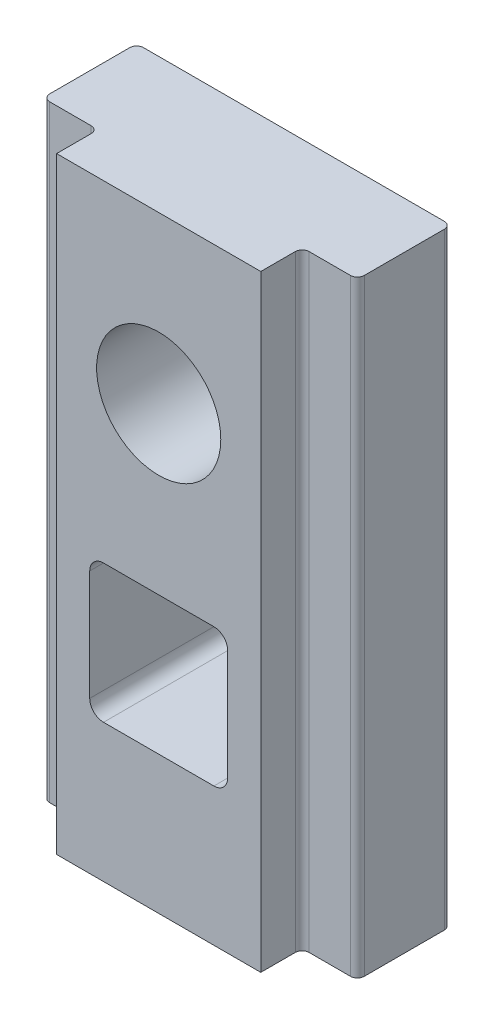
ISO-10303-21;
HEADER;
FILE_DESCRIPTION(('STEP AP214'),'2;1');
FILE_NAME('part.step','',(''),(''),'','','');
FILE_SCHEMA(('AUTOMOTIVE_DESIGN { 1 0 10303 214 1 1 1 1 }'));
ENDSEC;
DATA;
#1=APPLICATION_CONTEXT('core data for automotive mechanical design processes');
#2=APPLICATION_PROTOCOL_DEFINITION('international standard','automotive_design',2000,#1);
#3=PRODUCT_CONTEXT('',#1,'mechanical');
#4=PRODUCT('Part','Part','',(#3));
#5=PRODUCT_RELATED_PRODUCT_CATEGORY('part','',(#4));
#6=PRODUCT_DEFINITION_FORMATION('','',#4);
#7=PRODUCT_DEFINITION_CONTEXT('part definition',#1,'design');
#8=PRODUCT_DEFINITION('design','',#6,#7);
#9=PRODUCT_DEFINITION_SHAPE('','',#8);
#10=(LENGTH_UNIT() NAMED_UNIT(*) SI_UNIT(.MILLI.,.METRE.));
#11=(NAMED_UNIT(*) PLANE_ANGLE_UNIT() SI_UNIT($,.RADIAN.));
#12=(NAMED_UNIT(*) SI_UNIT($,.STERADIAN.) SOLID_ANGLE_UNIT());
#13=UNCERTAINTY_MEASURE_WITH_UNIT(LENGTH_MEASURE(1.E-05),#10,'distance_accuracy_value','');
#14=(GEOMETRIC_REPRESENTATION_CONTEXT(3) GLOBAL_UNCERTAINTY_ASSIGNED_CONTEXT((#13)) GLOBAL_UNIT_ASSIGNED_CONTEXT((#10,
#11,#12)) REPRESENTATION_CONTEXT('',''));
#15=CARTESIAN_POINT('',(0.,0.,0.));
#16=DIRECTION('',(0.,0.,1.));
#17=DIRECTION('',(1.,0.,0.));
#18=AXIS2_PLACEMENT_3D('',#15,#16,#17);
#19=CARTESIAN_POINT('',(5.7,-22.,-0.3));
#20=DIRECTION('',(0.,0.,1.));
#21=DIRECTION('',(1.,0.,0.));
#22=AXIS2_PLACEMENT_3D('',#19,#20,#21);
#23=PLANE('',#22);
#24=DIRECTION('',(1.,0.,0.));
#25=VECTOR('',#24,1.);
#26=CARTESIAN_POINT('',(5.7,-22.,-0.3));
#27=LINE('',#26,#25);
#28=CARTESIAN_POINT('',(3.95,-22.,-0.3));
#29=VERTEX_POINT('',#28);
#30=CARTESIAN_POINT('',(5.45,-22.,-0.3));
#31=VERTEX_POINT('',#30);
#32=EDGE_CURVE('E233',#29,#31,#27,.T.);
#33=ORIENTED_EDGE('',*,*,#32,.T.);
#34=DIRECTION('',(0.,1.,0.));
#35=VECTOR('',#34,1.);
#36=CARTESIAN_POINT('',(5.45,-22.,-0.3));
#37=LINE('',#36,#35);
#38=CARTESIAN_POINT('',(5.45,0.,-0.3));
#39=VERTEX_POINT('',#38);
#40=EDGE_CURVE('E263',#31,#39,#37,.T.);
#41=ORIENTED_EDGE('',*,*,#40,.T.);
#42=DIRECTION('',(1.,0.,0.));
#43=VECTOR('',#42,1.);
#44=CARTESIAN_POINT('',(5.7,0.,-0.3));
#45=LINE('',#44,#43);
#46=CARTESIAN_POINT('',(3.95,0.,-0.3));
#47=VERTEX_POINT('',#46);
#48=EDGE_CURVE('E211',#47,#39,#45,.T.);
#49=ORIENTED_EDGE('',*,*,#48,.F.);
#50=DIRECTION('',(0.,1.,0.));
#51=VECTOR('',#50,1.);
#52=CARTESIAN_POINT('',(3.95,-22.,-0.3));
#53=LINE('',#52,#51);
#54=EDGE_CURVE('E261',#47,#29,#53,.F.);
#55=ORIENTED_EDGE('',*,*,#54,.T.);
#56=EDGE_LOOP('',(#33,#41,#49,#55));
#57=FACE_BOUND('',#56,.T.);
#58=ADVANCED_FACE('F32',(#57),#23,.T.);
#59=CARTESIAN_POINT('',(3.7,-22.,-0.3));
#60=DIRECTION('',(1.,0.,0.));
#61=DIRECTION('',(0.,0.,-1.));
#62=AXIS2_PLACEMENT_3D('',#59,#60,#61);
#63=PLANE('',#62);
#64=DIRECTION('',(0.,0.,-1.));
#65=VECTOR('',#64,1.);
#66=CARTESIAN_POINT('',(3.7,-22.,-0.3));
#67=LINE('',#66,#65);
#68=CARTESIAN_POINT('',(3.7,-22.,1.2));
#69=VERTEX_POINT('',#68);
#70=CARTESIAN_POINT('',(3.7,-22.,-0.0499999999999998));
#71=VERTEX_POINT('',#70);
#72=EDGE_CURVE('E202',#69,#71,#67,.T.);
#73=ORIENTED_EDGE('',*,*,#72,.T.);
#74=DIRECTION('',(0.,1.,0.));
#75=VECTOR('',#74,1.);
#76=CARTESIAN_POINT('',(3.7,0.,-0.0499999999999998));
#77=LINE('',#76,#75);
#78=CARTESIAN_POINT('',(3.7,0.,-0.0499999999999998));
#79=VERTEX_POINT('',#78);
#80=EDGE_CURVE('E266',#71,#79,#77,.T.);
#81=ORIENTED_EDGE('',*,*,#80,.T.);
#82=DIRECTION('',(0.,0.,-1.));
#83=VECTOR('',#82,1.);
#84=CARTESIAN_POINT('',(3.7,0.,-0.3));
#85=LINE('',#84,#83);
#86=CARTESIAN_POINT('',(3.7,0.,1.2));
#87=VERTEX_POINT('',#86);
#88=EDGE_CURVE('E230',#87,#79,#85,.T.);
#89=ORIENTED_EDGE('',*,*,#88,.F.);
#90=DIRECTION('',(0.,1.,0.));
#91=VECTOR('',#90,1.);
#92=CARTESIAN_POINT('',(3.7,-22.,1.2));
#93=LINE('',#92,#91);
#94=EDGE_CURVE('E201',#69,#87,#93,.T.);
#95=ORIENTED_EDGE('',*,*,#94,.F.);
#96=EDGE_LOOP('',(#73,#81,#89,#95));
#97=FACE_BOUND('',#96,.T.);
#98=ADVANCED_FACE('F414',(#97),#63,.T.);
#99=CARTESIAN_POINT('',(-3.7,-22.,1.2));
#100=DIRECTION('',(0.,0.,1.));
#101=DIRECTION('',(1.,0.,0.));
#102=AXIS2_PLACEMENT_3D('',#99,#100,#101);
#103=PLANE('',#102);
#104=CARTESIAN_POINT('',(0.,-6.,1.2));
#105=DIRECTION('',(0.,0.,1.));
#106=DIRECTION('',(1.,0.,0.));
#107=AXIS2_PLACEMENT_3D('',#104,#105,#106);
#108=CIRCLE('',#107,2.25);
#109=CARTESIAN_POINT('',(2.25,-6.,1.2));
#110=VERTEX_POINT('',#109);
#111=EDGE_CURVE('E346',#110,#110,#108,.T.);
#112=ORIENTED_EDGE('',*,*,#111,.F.);
#113=EDGE_LOOP('',(#112));
#114=FACE_BOUND('',#113,.T.);
#115=DIRECTION('',(0.,1.,0.));
#116=VECTOR('',#115,1.);
#117=CARTESIAN_POINT('',(2.5,-12.,1.2));
#118=LINE('',#117,#116);
#119=CARTESIAN_POINT('',(2.5,-16.5,1.2));
#120=VERTEX_POINT('',#119);
#121=CARTESIAN_POINT('',(2.5,-12.5,1.2));
#122=VERTEX_POINT('',#121);
#123=EDGE_CURVE('E322',#120,#122,#118,.T.);
#124=ORIENTED_EDGE('',*,*,#123,.F.);
#125=CARTESIAN_POINT('',(2.,-16.5,1.2));
#126=DIRECTION('',(0.,0.,1.));
#127=DIRECTION('',(1.,0.,0.));
#128=AXIS2_PLACEMENT_3D('',#125,#126,#127);
#129=CIRCLE('',#128,0.5);
#130=CARTESIAN_POINT('',(2.,-17.,1.2));
#131=VERTEX_POINT('',#130);
#132=EDGE_CURVE('E307',#120,#131,#129,.F.);
#133=ORIENTED_EDGE('',*,*,#132,.T.);
#134=DIRECTION('',(1.,0.,0.));
#135=VECTOR('',#134,1.);
#136=CARTESIAN_POINT('',(-2.5,-17.,1.2));
#137=LINE('',#136,#135);
#138=CARTESIAN_POINT('',(-2.,-17.,1.2));
#139=VERTEX_POINT('',#138);
#140=EDGE_CURVE('E341',#139,#131,#137,.T.);
#141=ORIENTED_EDGE('',*,*,#140,.F.);
#142=CARTESIAN_POINT('',(-2.,-16.5,1.2));
#143=DIRECTION('',(0.,0.,1.));
#144=DIRECTION('',(1.,0.,0.));
#145=AXIS2_PLACEMENT_3D('',#142,#143,#144);
#146=CIRCLE('',#145,0.5);
#147=CARTESIAN_POINT('',(-2.5,-16.5,1.2));
#148=VERTEX_POINT('',#147);
#149=EDGE_CURVE('E311',#139,#148,#146,.F.);
#150=ORIENTED_EDGE('',*,*,#149,.T.);
#151=DIRECTION('',(0.,-1.,0.));
#152=VECTOR('',#151,1.);
#153=CARTESIAN_POINT('',(-2.5,-12.,1.2));
#154=LINE('',#153,#152);
#155=CARTESIAN_POINT('',(-2.5,-12.5,1.2));
#156=VERTEX_POINT('',#155);
#157=EDGE_CURVE('E349',#156,#148,#154,.T.);
#158=ORIENTED_EDGE('',*,*,#157,.F.);
#159=CARTESIAN_POINT('',(-2.,-12.5,1.2));
#160=DIRECTION('',(0.,0.,1.));
#161=DIRECTION('',(1.,0.,0.));
#162=AXIS2_PLACEMENT_3D('',#159,#160,#161);
#163=CIRCLE('',#162,0.5);
#164=CARTESIAN_POINT('',(-2.,-12.,1.2));
#165=VERTEX_POINT('',#164);
#166=EDGE_CURVE('E315',#156,#165,#163,.F.);
#167=ORIENTED_EDGE('',*,*,#166,.T.);
#168=DIRECTION('',(-1.,0.,0.));
#169=VECTOR('',#168,1.);
#170=CARTESIAN_POINT('',(-2.5,-12.,1.2));
#171=LINE('',#170,#169);
#172=CARTESIAN_POINT('',(2.,-12.,1.2));
#173=VERTEX_POINT('',#172);
#174=EDGE_CURVE('E323',#173,#165,#171,.T.);
#175=ORIENTED_EDGE('',*,*,#174,.F.);
#176=CARTESIAN_POINT('',(2.,-12.5,1.2));
#177=DIRECTION('',(0.,0.,1.));
#178=DIRECTION('',(1.,0.,0.));
#179=AXIS2_PLACEMENT_3D('',#176,#177,#178);
#180=CIRCLE('',#179,0.5);
#181=EDGE_CURVE('E40',#173,#122,#180,.F.);
#182=ORIENTED_EDGE('',*,*,#181,.T.);
#183=EDGE_LOOP('',(#124,#133,#141,#150,#158,#167,#175,#182));
#184=FACE_BOUND('',#183,.T.);
#185=DIRECTION('',(1.,0.,0.));
#186=VECTOR('',#185,1.);
#187=CARTESIAN_POINT('',(-3.7,0.,1.2));
#188=LINE('',#187,#186);
#189=CARTESIAN_POINT('',(-3.7,0.,1.2));
#190=VERTEX_POINT('',#189);
#191=EDGE_CURVE('E200',#190,#87,#188,.T.);
#192=ORIENTED_EDGE('',*,*,#191,.F.);
#193=DIRECTION('',(0.,1.,0.));
#194=VECTOR('',#193,1.);
#195=CARTESIAN_POINT('',(-3.7,-22.,1.2));
#196=LINE('',#195,#194);
#197=CARTESIAN_POINT('',(-3.7,-22.,1.2));
#198=VERTEX_POINT('',#197);
#199=EDGE_CURVE('E185',#198,#190,#196,.T.);
#200=ORIENTED_EDGE('',*,*,#199,.F.);
#201=DIRECTION('',(1.,0.,0.));
#202=VECTOR('',#201,1.);
#203=CARTESIAN_POINT('',(-3.7,-22.,1.2));
#204=LINE('',#203,#202);
#205=EDGE_CURVE('E192',#198,#69,#204,.T.);
#206=ORIENTED_EDGE('',*,*,#205,.T.);
#207=ORIENTED_EDGE('',*,*,#94,.T.);
#208=EDGE_LOOP('',(#192,#200,#206,#207));
#209=FACE_BOUND('',#208,.T.);
#210=ADVANCED_FACE('F197',(#114,#184,#209),#103,.T.);
#211=CARTESIAN_POINT('',(-3.7,-22.,-0.3));
#212=DIRECTION('',(-1.,0.,0.));
#213=DIRECTION('',(0.,0.,1.));
#214=AXIS2_PLACEMENT_3D('',#211,#212,#213);
#215=PLANE('',#214);
#216=DIRECTION('',(0.,0.,1.));
#217=VECTOR('',#216,1.);
#218=CARTESIAN_POINT('',(-3.7,0.,-0.3));
#219=LINE('',#218,#217);
#220=CARTESIAN_POINT('',(-3.7,0.,-0.05));
#221=VERTEX_POINT('',#220);
#222=EDGE_CURVE('E227',#221,#190,#219,.T.);
#223=ORIENTED_EDGE('',*,*,#222,.F.);
#224=DIRECTION('',(0.,1.,0.));
#225=VECTOR('',#224,1.);
#226=CARTESIAN_POINT('',(-3.7,-22.,-0.05));
#227=LINE('',#226,#225);
#228=CARTESIAN_POINT('',(-3.7,-22.,-0.05));
#229=VERTEX_POINT('',#228);
#230=EDGE_CURVE('E188',#221,#229,#227,.F.);
#231=ORIENTED_EDGE('',*,*,#230,.T.);
#232=DIRECTION('',(0.,0.,1.));
#233=VECTOR('',#232,1.);
#234=CARTESIAN_POINT('',(-3.7,-22.,-0.3));
#235=LINE('',#234,#233);
#236=EDGE_CURVE('E181',#229,#198,#235,.T.);
#237=ORIENTED_EDGE('',*,*,#236,.T.);
#238=ORIENTED_EDGE('',*,*,#199,.T.);
#239=EDGE_LOOP('',(#223,#231,#237,#238));
#240=FACE_BOUND('',#239,.T.);
#241=ADVANCED_FACE('F184',(#240),#215,.T.);
#242=CARTESIAN_POINT('',(-5.7,-22.,-0.3));
#243=DIRECTION('',(0.,0.,1.));
#244=DIRECTION('',(1.,0.,0.));
#245=AXIS2_PLACEMENT_3D('',#242,#243,#244);
#246=PLANE('',#245);
#247=DIRECTION('',(1.,0.,0.));
#248=VECTOR('',#247,1.);
#249=CARTESIAN_POINT('',(-5.7,-22.,-0.3));
#250=LINE('',#249,#248);
#251=CARTESIAN_POINT('',(-5.45,-22.,-0.3));
#252=VERTEX_POINT('',#251);
#253=CARTESIAN_POINT('',(-3.95,-22.,-0.3));
#254=VERTEX_POINT('',#253);
#255=EDGE_CURVE('E193',#252,#254,#250,.T.);
#256=ORIENTED_EDGE('',*,*,#255,.T.);
#257=DIRECTION('',(0.,1.,0.));
#258=VECTOR('',#257,1.);
#259=CARTESIAN_POINT('',(-3.95,0.,-0.3));
#260=LINE('',#259,#258);
#261=CARTESIAN_POINT('',(-3.95,0.,-0.3));
#262=VERTEX_POINT('',#261);
#263=EDGE_CURVE('E271',#254,#262,#260,.T.);
#264=ORIENTED_EDGE('',*,*,#263,.T.);
#265=DIRECTION('',(1.,0.,0.));
#266=VECTOR('',#265,1.);
#267=CARTESIAN_POINT('',(-5.7,0.,-0.3));
#268=LINE('',#267,#266);
#269=CARTESIAN_POINT('',(-5.45,0.,-0.3));
#270=VERTEX_POINT('',#269);
#271=EDGE_CURVE('E224',#270,#262,#268,.T.);
#272=ORIENTED_EDGE('',*,*,#271,.F.);
#273=DIRECTION('',(0.,1.,0.));
#274=VECTOR('',#273,1.);
#275=CARTESIAN_POINT('',(-5.45,-22.,-0.3));
#276=LINE('',#275,#274);
#277=EDGE_CURVE('E269',#270,#252,#276,.F.);
#278=ORIENTED_EDGE('',*,*,#277,.T.);
#279=EDGE_LOOP('',(#256,#264,#272,#278));
#280=FACE_BOUND('',#279,.T.);
#281=ADVANCED_FACE('F368',(#280),#246,.T.);
#282=CARTESIAN_POINT('',(-5.7,-22.,-3.7));
#283=DIRECTION('',(-1.,0.,0.));
#284=DIRECTION('',(0.,0.,1.));
#285=AXIS2_PLACEMENT_3D('',#282,#283,#284);
#286=PLANE('',#285);
#287=DIRECTION('',(0.,0.,1.));
#288=VECTOR('',#287,1.);
#289=CARTESIAN_POINT('',(-5.7,-22.,-3.7));
#290=LINE('',#289,#288);
#291=CARTESIAN_POINT('',(-5.7,-22.,-3.45));
#292=VERTEX_POINT('',#291);
#293=CARTESIAN_POINT('',(-5.7,-22.,-0.55));
#294=VERTEX_POINT('',#293);
#295=EDGE_CURVE('E362',#292,#294,#290,.T.);
#296=ORIENTED_EDGE('',*,*,#295,.T.);
#297=DIRECTION('',(0.,1.,0.));
#298=VECTOR('',#297,1.);
#299=CARTESIAN_POINT('',(-5.7,-22.,-0.55));
#300=LINE('',#299,#298);
#301=CARTESIAN_POINT('',(-5.7,0.,-0.55));
#302=VERTEX_POINT('',#301);
#303=EDGE_CURVE('E277',#294,#302,#300,.T.);
#304=ORIENTED_EDGE('',*,*,#303,.T.);
#305=DIRECTION('',(0.,0.,1.));
#306=VECTOR('',#305,1.);
#307=CARTESIAN_POINT('',(-5.7,0.,-3.7));
#308=LINE('',#307,#306);
#309=CARTESIAN_POINT('',(-5.7,0.,-3.45));
#310=VERTEX_POINT('',#309);
#311=EDGE_CURVE('E221',#310,#302,#308,.T.);
#312=ORIENTED_EDGE('',*,*,#311,.F.);
#313=DIRECTION('',(0.,1.,0.));
#314=VECTOR('',#313,1.);
#315=CARTESIAN_POINT('',(-5.7,-22.,-3.45));
#316=LINE('',#315,#314);
#317=EDGE_CURVE('E275',#310,#292,#316,.F.);
#318=ORIENTED_EDGE('',*,*,#317,.T.);
#319=EDGE_LOOP('',(#296,#304,#312,#318));
#320=FACE_BOUND('',#319,.T.);
#321=ADVANCED_FACE('F382',(#320),#286,.T.);
#322=CARTESIAN_POINT('',(5.7,-22.,-3.7));
#323=DIRECTION('',(0.,0.,-1.));
#324=DIRECTION('',(-1.,0.,0.));
#325=AXIS2_PLACEMENT_3D('',#322,#323,#324);
#326=PLANE('',#325);
#327=CARTESIAN_POINT('',(0.,-6.,-3.7));
#328=DIRECTION('',(0.,0.,1.));
#329=DIRECTION('',(1.,0.,0.));
#330=AXIS2_PLACEMENT_3D('',#327,#328,#329);
#331=CIRCLE('',#330,2.25);
#332=CARTESIAN_POINT('',(2.25,-6.,-3.7));
#333=VERTEX_POINT('',#332);
#334=EDGE_CURVE('E215',#333,#333,#331,.T.);
#335=ORIENTED_EDGE('',*,*,#334,.T.);
#336=EDGE_LOOP('',(#335));
#337=FACE_BOUND('',#336,.T.);
#338=DIRECTION('',(1.,0.,0.));
#339=VECTOR('',#338,1.);
#340=CARTESIAN_POINT('',(-2.5,-17.,-3.7));
#341=LINE('',#340,#339);
#342=CARTESIAN_POINT('',(-2.,-17.,-3.7));
#343=VERTEX_POINT('',#342);
#344=CARTESIAN_POINT('',(2.,-17.,-3.7));
#345=VERTEX_POINT('',#344);
#346=EDGE_CURVE('E339',#343,#345,#341,.T.);
#347=ORIENTED_EDGE('',*,*,#346,.T.);
#348=CARTESIAN_POINT('',(2.,-16.5,-3.7));
#349=DIRECTION('',(0.,0.,-1.));
#350=DIRECTION('',(-1.,0.,0.));
#351=AXIS2_PLACEMENT_3D('',#348,#349,#350);
#352=CIRCLE('',#351,0.5);
#353=CARTESIAN_POINT('',(2.5,-16.5,-3.7));
#354=VERTEX_POINT('',#353);
#355=EDGE_CURVE('E309',#345,#354,#352,.F.);
#356=ORIENTED_EDGE('',*,*,#355,.T.);
#357=DIRECTION('',(0.,1.,0.));
#358=VECTOR('',#357,1.);
#359=CARTESIAN_POINT('',(2.5,-12.,-3.7));
#360=LINE('',#359,#358);
#361=CARTESIAN_POINT('',(2.5,-12.5,-3.7));
#362=VERTEX_POINT('',#361);
#363=EDGE_CURVE('E336',#354,#362,#360,.T.);
#364=ORIENTED_EDGE('',*,*,#363,.T.);
#365=CARTESIAN_POINT('',(2.,-12.5,-3.7));
#366=DIRECTION('',(0.,0.,-1.));
#367=DIRECTION('',(-1.,0.,0.));
#368=AXIS2_PLACEMENT_3D('',#365,#366,#367);
#369=CIRCLE('',#368,0.5);
#370=CARTESIAN_POINT('',(2.,-12.,-3.7));
#371=VERTEX_POINT('',#370);
#372=EDGE_CURVE('E11',#362,#371,#369,.F.);
#373=ORIENTED_EDGE('',*,*,#372,.T.);
#374=DIRECTION('',(-1.,0.,0.));
#375=VECTOR('',#374,1.);
#376=CARTESIAN_POINT('',(-2.5,-12.,-3.7));
#377=LINE('',#376,#375);
#378=CARTESIAN_POINT('',(-2.,-12.,-3.7));
#379=VERTEX_POINT('',#378);
#380=EDGE_CURVE('E333',#371,#379,#377,.T.);
#381=ORIENTED_EDGE('',*,*,#380,.T.);
#382=CARTESIAN_POINT('',(-2.,-12.5,-3.7));
#383=DIRECTION('',(0.,0.,-1.));
#384=DIRECTION('',(-1.,0.,0.));
#385=AXIS2_PLACEMENT_3D('',#382,#383,#384);
#386=CIRCLE('',#385,0.5);
#387=CARTESIAN_POINT('',(-2.5,-12.5,-3.7));
#388=VERTEX_POINT('',#387);
#389=EDGE_CURVE('E317',#379,#388,#386,.F.);
#390=ORIENTED_EDGE('',*,*,#389,.T.);
#391=DIRECTION('',(0.,-1.,0.));
#392=VECTOR('',#391,1.);
#393=CARTESIAN_POINT('',(-2.5,-12.,-3.7));
#394=LINE('',#393,#392);
#395=CARTESIAN_POINT('',(-2.5,-16.5,-3.7));
#396=VERTEX_POINT('',#395);
#397=EDGE_CURVE('E335',#388,#396,#394,.T.);
#398=ORIENTED_EDGE('',*,*,#397,.T.);
#399=CARTESIAN_POINT('',(-2.,-16.5,-3.7));
#400=DIRECTION('',(0.,0.,-1.));
#401=DIRECTION('',(-1.,0.,0.));
#402=AXIS2_PLACEMENT_3D('',#399,#400,#401);
#403=CIRCLE('',#402,0.5);
#404=EDGE_CURVE('E313',#396,#343,#403,.F.);
#405=ORIENTED_EDGE('',*,*,#404,.T.);
#406=EDGE_LOOP('',(#347,#356,#364,#373,#381,#390,#398,#405));
#407=FACE_BOUND('',#406,.T.);
#408=DIRECTION('',(-1.,0.,0.));
#409=VECTOR('',#408,1.);
#410=CARTESIAN_POINT('',(5.7,0.,-3.7));
#411=LINE('',#410,#409);
#412=CARTESIAN_POINT('',(5.45,0.,-3.7));
#413=VERTEX_POINT('',#412);
#414=CARTESIAN_POINT('',(-5.45,0.,-3.7));
#415=VERTEX_POINT('',#414);
#416=EDGE_CURVE('E218',#413,#415,#411,.T.);
#417=ORIENTED_EDGE('',*,*,#416,.F.);
#418=DIRECTION('',(0.,1.,0.));
#419=VECTOR('',#418,1.);
#420=CARTESIAN_POINT('',(5.45,-22.,-3.7));
#421=LINE('',#420,#419);
#422=CARTESIAN_POINT('',(5.45,-22.,-3.7));
#423=VERTEX_POINT('',#422);
#424=EDGE_CURVE('E251',#413,#423,#421,.F.);
#425=ORIENTED_EDGE('',*,*,#424,.T.);
#426=DIRECTION('',(-1.,0.,0.));
#427=VECTOR('',#426,1.);
#428=CARTESIAN_POINT('',(5.7,-22.,-3.7));
#429=LINE('',#428,#427);
#430=CARTESIAN_POINT('',(-5.45,-22.,-3.7));
#431=VERTEX_POINT('',#430);
#432=EDGE_CURVE('E359',#423,#431,#429,.T.);
#433=ORIENTED_EDGE('',*,*,#432,.T.);
#434=DIRECTION('',(0.,1.,0.));
#435=VECTOR('',#434,1.);
#436=CARTESIAN_POINT('',(-5.45,-22.,-3.7));
#437=LINE('',#436,#435);
#438=EDGE_CURVE('E248',#431,#415,#437,.T.);
#439=ORIENTED_EDGE('',*,*,#438,.T.);
#440=EDGE_LOOP('',(#417,#425,#433,#439));
#441=FACE_BOUND('',#440,.T.);
#442=ADVANCED_FACE('F391',(#337,#407,#441),#326,.T.);
#443=CARTESIAN_POINT('',(5.7,-22.,-3.7));
#444=DIRECTION('',(1.,0.,0.));
#445=DIRECTION('',(0.,0.,-1.));
#446=AXIS2_PLACEMENT_3D('',#443,#444,#445);
#447=PLANE('',#446);
#448=DIRECTION('',(0.,0.,-1.));
#449=VECTOR('',#448,1.);
#450=CARTESIAN_POINT('',(5.7,-22.,-3.7));
#451=LINE('',#450,#449);
#452=CARTESIAN_POINT('',(5.7,-22.,-0.55));
#453=VERTEX_POINT('',#452);
#454=CARTESIAN_POINT('',(5.7,-22.,-3.45));
#455=VERTEX_POINT('',#454);
#456=EDGE_CURVE('E356',#453,#455,#451,.T.);
#457=ORIENTED_EDGE('',*,*,#456,.T.);
#458=DIRECTION('',(0.,1.,0.));
#459=VECTOR('',#458,1.);
#460=CARTESIAN_POINT('',(5.7,-22.,-3.45));
#461=LINE('',#460,#459);
#462=CARTESIAN_POINT('',(5.7,0.,-3.45));
#463=VERTEX_POINT('',#462);
#464=EDGE_CURVE('E237',#455,#463,#461,.T.);
#465=ORIENTED_EDGE('',*,*,#464,.T.);
#466=DIRECTION('',(0.,0.,-1.));
#467=VECTOR('',#466,1.);
#468=CARTESIAN_POINT('',(5.7,0.,-3.7));
#469=LINE('',#468,#467);
#470=CARTESIAN_POINT('',(5.7,0.,-0.55));
#471=VERTEX_POINT('',#470);
#472=EDGE_CURVE('E214',#471,#463,#469,.T.);
#473=ORIENTED_EDGE('',*,*,#472,.F.);
#474=DIRECTION('',(0.,1.,0.));
#475=VECTOR('',#474,1.);
#476=CARTESIAN_POINT('',(5.7,-22.,-0.55));
#477=LINE('',#476,#475);
#478=EDGE_CURVE('E234',#471,#453,#477,.F.);
#479=ORIENTED_EDGE('',*,*,#478,.T.);
#480=EDGE_LOOP('',(#457,#465,#473,#479));
#481=FACE_BOUND('',#480,.T.);
#482=ADVANCED_FACE('F399',(#481),#447,.T.);
#483=CARTESIAN_POINT('',(0.,-22.,0.));
#484=DIRECTION('',(0.,1.,0.));
#485=DIRECTION('',(0.,0.,1.));
#486=AXIS2_PLACEMENT_3D('',#483,#484,#485);
#487=PLANE('',#486);
#488=ORIENTED_EDGE('',*,*,#432,.F.);
#489=CARTESIAN_POINT('',(5.45,-22.,-3.45));
#490=DIRECTION('',(0.,1.,0.));
#491=DIRECTION('',(0.,0.,1.));
#492=AXIS2_PLACEMENT_3D('',#489,#490,#491);
#493=CIRCLE('',#492,0.25);
#494=EDGE_CURVE('E259',#423,#455,#493,.F.);
#495=ORIENTED_EDGE('',*,*,#494,.T.);
#496=ORIENTED_EDGE('',*,*,#456,.F.);
#497=CARTESIAN_POINT('',(5.45,-22.,-0.55));
#498=DIRECTION('',(0.,1.,0.));
#499=DIRECTION('',(0.,0.,1.));
#500=AXIS2_PLACEMENT_3D('',#497,#498,#499);
#501=CIRCLE('',#500,0.25);
#502=EDGE_CURVE('E257',#453,#31,#501,.F.);
#503=ORIENTED_EDGE('',*,*,#502,.T.);
#504=ORIENTED_EDGE('',*,*,#32,.F.);
#505=CARTESIAN_POINT('',(3.95,-22.,-0.0499999999999998));
#506=DIRECTION('',(0.,1.,0.));
#507=DIRECTION('',(0.,0.,1.));
#508=AXIS2_PLACEMENT_3D('',#505,#506,#507);
#509=CIRCLE('',#508,0.25);
#510=EDGE_CURVE('E282',#29,#71,#509,.T.);
#511=ORIENTED_EDGE('',*,*,#510,.T.);
#512=ORIENTED_EDGE('',*,*,#72,.F.);
#513=ORIENTED_EDGE('',*,*,#205,.F.);
#514=ORIENTED_EDGE('',*,*,#236,.F.);
#515=CARTESIAN_POINT('',(-3.95,-22.,-0.05));
#516=DIRECTION('',(0.,1.,0.));
#517=DIRECTION('',(0.,0.,1.));
#518=AXIS2_PLACEMENT_3D('',#515,#516,#517);
#519=CIRCLE('',#518,0.25);
#520=EDGE_CURVE('E286',#229,#254,#519,.T.);
#521=ORIENTED_EDGE('',*,*,#520,.T.);
#522=ORIENTED_EDGE('',*,*,#255,.F.);
#523=CARTESIAN_POINT('',(-5.45,-22.,-0.55));
#524=DIRECTION('',(0.,1.,0.));
#525=DIRECTION('',(0.,0.,1.));
#526=AXIS2_PLACEMENT_3D('',#523,#524,#525);
#527=CIRCLE('',#526,0.25);
#528=EDGE_CURVE('E255',#252,#294,#527,.F.);
#529=ORIENTED_EDGE('',*,*,#528,.T.);
#530=ORIENTED_EDGE('',*,*,#295,.F.);
#531=CARTESIAN_POINT('',(-5.45,-22.,-3.45));
#532=DIRECTION('',(0.,1.,0.));
#533=DIRECTION('',(0.,0.,1.));
#534=AXIS2_PLACEMENT_3D('',#531,#532,#533);
#535=CIRCLE('',#534,0.25);
#536=EDGE_CURVE('E253',#292,#431,#535,.F.);
#537=ORIENTED_EDGE('',*,*,#536,.T.);
#538=EDGE_LOOP('',(#488,#495,#496,#503,#504,#511,#512,#513,#514,#521,#522,#529,#530,#537));
#539=FACE_BOUND('',#538,.T.);
#540=ADVANCED_FACE('F205',(#539),#487,.F.);
#541=CARTESIAN_POINT('',(0.,0.,0.));
#542=DIRECTION('',(0.,1.,0.));
#543=DIRECTION('',(0.,0.,1.));
#544=AXIS2_PLACEMENT_3D('',#541,#542,#543);
#545=PLANE('',#544);
#546=ORIENTED_EDGE('',*,*,#472,.T.);
#547=CARTESIAN_POINT('',(5.45,0.,-3.45));
#548=DIRECTION('',(0.,1.,0.));
#549=DIRECTION('',(0.,0.,1.));
#550=AXIS2_PLACEMENT_3D('',#547,#548,#549);
#551=CIRCLE('',#550,0.25);
#552=EDGE_CURVE('E246',#463,#413,#551,.T.);
#553=ORIENTED_EDGE('',*,*,#552,.T.);
#554=ORIENTED_EDGE('',*,*,#416,.T.);
#555=CARTESIAN_POINT('',(-5.45,0.,-3.45));
#556=DIRECTION('',(0.,1.,0.));
#557=DIRECTION('',(0.,0.,1.));
#558=AXIS2_PLACEMENT_3D('',#555,#556,#557);
#559=CIRCLE('',#558,0.25);
#560=EDGE_CURVE('E240',#415,#310,#559,.T.);
#561=ORIENTED_EDGE('',*,*,#560,.T.);
#562=ORIENTED_EDGE('',*,*,#311,.T.);
#563=CARTESIAN_POINT('',(-5.45,0.,-0.55));
#564=DIRECTION('',(0.,1.,0.));
#565=DIRECTION('',(0.,0.,1.));
#566=AXIS2_PLACEMENT_3D('',#563,#564,#565);
#567=CIRCLE('',#566,0.25);
#568=EDGE_CURVE('E242',#302,#270,#567,.T.);
#569=ORIENTED_EDGE('',*,*,#568,.T.);
#570=ORIENTED_EDGE('',*,*,#271,.T.);
#571=CARTESIAN_POINT('',(-3.95,0.,-0.05));
#572=DIRECTION('',(0.,1.,0.));
#573=DIRECTION('',(0.,0.,1.));
#574=AXIS2_PLACEMENT_3D('',#571,#572,#573);
#575=CIRCLE('',#574,0.25);
#576=EDGE_CURVE('E284',#262,#221,#575,.F.);
#577=ORIENTED_EDGE('',*,*,#576,.T.);
#578=ORIENTED_EDGE('',*,*,#222,.T.);
#579=ORIENTED_EDGE('',*,*,#191,.T.);
#580=ORIENTED_EDGE('',*,*,#88,.T.);
#581=CARTESIAN_POINT('',(3.95,0.,-0.0499999999999998));
#582=DIRECTION('',(0.,1.,0.));
#583=DIRECTION('',(0.,0.,1.));
#584=AXIS2_PLACEMENT_3D('',#581,#582,#583);
#585=CIRCLE('',#584,0.25);
#586=EDGE_CURVE('E280',#79,#47,#585,.F.);
#587=ORIENTED_EDGE('',*,*,#586,.T.);
#588=ORIENTED_EDGE('',*,*,#48,.T.);
#589=CARTESIAN_POINT('',(5.45,0.,-0.55));
#590=DIRECTION('',(0.,1.,0.));
#591=DIRECTION('',(0.,0.,1.));
#592=AXIS2_PLACEMENT_3D('',#589,#590,#591);
#593=CIRCLE('',#592,0.25);
#594=EDGE_CURVE('E244',#39,#471,#593,.T.);
#595=ORIENTED_EDGE('',*,*,#594,.T.);
#596=EDGE_LOOP('',(#546,#553,#554,#561,#562,#569,#570,#577,#578,#579,#580,#587,#588,#595));
#597=FACE_BOUND('',#596,.T.);
#598=ADVANCED_FACE('F375',(#597),#545,.T.);
#599=CARTESIAN_POINT('',(2.5,-12.,-3.7));
#600=DIRECTION('',(1.,0.,0.));
#601=DIRECTION('',(0.,0.,-1.));
#602=AXIS2_PLACEMENT_3D('',#599,#600,#601);
#603=PLANE('',#602);
#604=ORIENTED_EDGE('',*,*,#363,.F.);
#605=DIRECTION('',(0.,0.,1.));
#606=VECTOR('',#605,1.);
#607=CARTESIAN_POINT('',(2.5,-16.5,1.2));
#608=LINE('',#607,#606);
#609=EDGE_CURVE('E290',#354,#120,#608,.T.);
#610=ORIENTED_EDGE('',*,*,#609,.T.);
#611=ORIENTED_EDGE('',*,*,#123,.T.);
#612=DIRECTION('',(0.,0.,1.));
#613=VECTOR('',#612,1.);
#614=CARTESIAN_POINT('',(2.5,-12.5,-3.7));
#615=LINE('',#614,#613);
#616=EDGE_CURVE('E288',#122,#362,#615,.F.);
#617=ORIENTED_EDGE('',*,*,#616,.T.);
#618=EDGE_LOOP('',(#604,#610,#611,#617));
#619=FACE_BOUND('',#618,.T.);
#620=ADVANCED_FACE('F329',(#619),#603,.F.);
#621=CARTESIAN_POINT('',(-2.5,-17.,-3.7));
#622=DIRECTION('',(0.,-1.,0.));
#623=DIRECTION('',(0.,0.,-1.));
#624=AXIS2_PLACEMENT_3D('',#621,#622,#623);
#625=PLANE('',#624);
#626=ORIENTED_EDGE('',*,*,#140,.T.);
#627=DIRECTION('',(0.,0.,1.));
#628=VECTOR('',#627,1.);
#629=CARTESIAN_POINT('',(2.,-17.,-3.7));
#630=LINE('',#629,#628);
#631=EDGE_CURVE('E296',#131,#345,#630,.F.);
#632=ORIENTED_EDGE('',*,*,#631,.T.);
#633=ORIENTED_EDGE('',*,*,#346,.F.);
#634=DIRECTION('',(0.,0.,1.));
#635=VECTOR('',#634,1.);
#636=CARTESIAN_POINT('',(-2.,-17.,1.2));
#637=LINE('',#636,#635);
#638=EDGE_CURVE('E293',#343,#139,#637,.T.);
#639=ORIENTED_EDGE('',*,*,#638,.T.);
#640=EDGE_LOOP('',(#626,#632,#633,#639));
#641=FACE_BOUND('',#640,.T.);
#642=ADVANCED_FACE('F476',(#641),#625,.F.);
#643=CARTESIAN_POINT('',(-2.5,-12.,-3.7));
#644=DIRECTION('',(-1.,0.,0.));
#645=DIRECTION('',(0.,-1.,0.));
#646=AXIS2_PLACEMENT_3D('',#643,#644,#645);
#647=PLANE('',#646);
#648=ORIENTED_EDGE('',*,*,#157,.T.);
#649=DIRECTION('',(0.,0.,1.));
#650=VECTOR('',#649,1.);
#651=CARTESIAN_POINT('',(-2.5,-16.5,-3.7));
#652=LINE('',#651,#650);
#653=EDGE_CURVE('E301',#148,#396,#652,.F.);
#654=ORIENTED_EDGE('',*,*,#653,.T.);
#655=ORIENTED_EDGE('',*,*,#397,.F.);
#656=DIRECTION('',(0.,0.,1.));
#657=VECTOR('',#656,1.);
#658=CARTESIAN_POINT('',(-2.5,-12.5,1.2));
#659=LINE('',#658,#657);
#660=EDGE_CURVE('E298',#388,#156,#659,.T.);
#661=ORIENTED_EDGE('',*,*,#660,.T.);
#662=EDGE_LOOP('',(#648,#654,#655,#661));
#663=FACE_BOUND('',#662,.T.);
#664=ADVANCED_FACE('F469',(#663),#647,.F.);
#665=CARTESIAN_POINT('',(-2.5,-12.,-3.7));
#666=DIRECTION('',(0.,1.,0.));
#667=DIRECTION('',(0.,0.,1.));
#668=AXIS2_PLACEMENT_3D('',#665,#666,#667);
#669=PLANE('',#668);
#670=ORIENTED_EDGE('',*,*,#174,.T.);
#671=DIRECTION('',(0.,0.,1.));
#672=VECTOR('',#671,1.);
#673=CARTESIAN_POINT('',(-2.,-12.,-3.7));
#674=LINE('',#673,#672);
#675=EDGE_CURVE('E47',#165,#379,#674,.F.);
#676=ORIENTED_EDGE('',*,*,#675,.T.);
#677=ORIENTED_EDGE('',*,*,#380,.F.);
#678=DIRECTION('',(0.,0.,1.));
#679=VECTOR('',#678,1.);
#680=CARTESIAN_POINT('',(2.,-12.,1.2));
#681=LINE('',#680,#679);
#682=EDGE_CURVE('E303',#371,#173,#681,.T.);
#683=ORIENTED_EDGE('',*,*,#682,.T.);
#684=EDGE_LOOP('',(#670,#676,#677,#683));
#685=FACE_BOUND('',#684,.T.);
#686=ADVANCED_FACE('F332',(#685),#669,.F.);
#687=CARTESIAN_POINT('',(0.,-6.,-3.7));
#688=DIRECTION('',(0.,0.,1.));
#689=DIRECTION('',(1.,0.,0.));
#690=AXIS2_PLACEMENT_3D('',#687,#688,#689);
#691=CYLINDRICAL_SURFACE('',#690,2.25);
#692=ORIENTED_EDGE('',*,*,#334,.F.);
#693=EDGE_LOOP('',(#692));
#694=FACE_BOUND('',#693,.T.);
#695=ORIENTED_EDGE('',*,*,#111,.T.);
#696=EDGE_LOOP('',(#695));
#697=FACE_BOUND('',#696,.T.);
#698=ADVANCED_FACE('F441',(#694,#697),#691,.F.);
#699=CARTESIAN_POINT('',(5.45,-22.,-3.45));
#700=DIRECTION('',(0.,1.,0.));
#701=DIRECTION('',(0.,0.,1.));
#702=AXIS2_PLACEMENT_3D('',#699,#700,#701);
#703=CYLINDRICAL_SURFACE('',#702,0.25);
#704=ORIENTED_EDGE('',*,*,#494,.F.);
#705=ORIENTED_EDGE('',*,*,#424,.F.);
#706=ORIENTED_EDGE('',*,*,#552,.F.);
#707=ORIENTED_EDGE('',*,*,#464,.F.);
#708=EDGE_LOOP('',(#704,#705,#706,#707));
#709=FACE_BOUND('',#708,.T.);
#710=ADVANCED_FACE('F394',(#709),#703,.T.);
#711=CARTESIAN_POINT('',(5.45,-22.,-0.55));
#712=DIRECTION('',(0.,1.,0.));
#713=DIRECTION('',(0.,0.,1.));
#714=AXIS2_PLACEMENT_3D('',#711,#712,#713);
#715=CYLINDRICAL_SURFACE('',#714,0.25);
#716=ORIENTED_EDGE('',*,*,#502,.F.);
#717=ORIENTED_EDGE('',*,*,#478,.F.);
#718=ORIENTED_EDGE('',*,*,#594,.F.);
#719=ORIENTED_EDGE('',*,*,#40,.F.);
#720=EDGE_LOOP('',(#716,#717,#718,#719));
#721=FACE_BOUND('',#720,.T.);
#722=ADVANCED_FACE('F403',(#721),#715,.T.);
#723=CARTESIAN_POINT('',(3.95,-22.,-0.0499999999999998));
#724=DIRECTION('',(0.,-1.,0.));
#725=DIRECTION('',(0.,0.,-1.));
#726=AXIS2_PLACEMENT_3D('',#723,#724,#725);
#727=CYLINDRICAL_SURFACE('',#726,0.25);
#728=ORIENTED_EDGE('',*,*,#510,.F.);
#729=ORIENTED_EDGE('',*,*,#54,.F.);
#730=ORIENTED_EDGE('',*,*,#586,.F.);
#731=ORIENTED_EDGE('',*,*,#80,.F.);
#732=EDGE_LOOP('',(#728,#729,#730,#731));
#733=FACE_BOUND('',#732,.T.);
#734=ADVANCED_FACE('F411',(#733),#727,.F.);
#735=CARTESIAN_POINT('',(-3.95,-22.,-0.05));
#736=DIRECTION('',(0.,-1.,0.));
#737=DIRECTION('',(0.,0.,-1.));
#738=AXIS2_PLACEMENT_3D('',#735,#736,#737);
#739=CYLINDRICAL_SURFACE('',#738,0.25);
#740=ORIENTED_EDGE('',*,*,#520,.F.);
#741=ORIENTED_EDGE('',*,*,#230,.F.);
#742=ORIENTED_EDGE('',*,*,#576,.F.);
#743=ORIENTED_EDGE('',*,*,#263,.F.);
#744=EDGE_LOOP('',(#740,#741,#742,#743));
#745=FACE_BOUND('',#744,.T.);
#746=ADVANCED_FACE('F373',(#745),#739,.F.);
#747=CARTESIAN_POINT('',(-5.45,-22.,-0.55));
#748=DIRECTION('',(0.,1.,0.));
#749=DIRECTION('',(0.,0.,1.));
#750=AXIS2_PLACEMENT_3D('',#747,#748,#749);
#751=CYLINDRICAL_SURFACE('',#750,0.25);
#752=ORIENTED_EDGE('',*,*,#528,.F.);
#753=ORIENTED_EDGE('',*,*,#277,.F.);
#754=ORIENTED_EDGE('',*,*,#568,.F.);
#755=ORIENTED_EDGE('',*,*,#303,.F.);
#756=EDGE_LOOP('',(#752,#753,#754,#755));
#757=FACE_BOUND('',#756,.T.);
#758=ADVANCED_FACE('F377',(#757),#751,.T.);
#759=CARTESIAN_POINT('',(-5.45,-22.,-3.45));
#760=DIRECTION('',(0.,1.,0.));
#761=DIRECTION('',(0.,0.,1.));
#762=AXIS2_PLACEMENT_3D('',#759,#760,#761);
#763=CYLINDRICAL_SURFACE('',#762,0.25);
#764=ORIENTED_EDGE('',*,*,#536,.F.);
#765=ORIENTED_EDGE('',*,*,#317,.F.);
#766=ORIENTED_EDGE('',*,*,#560,.F.);
#767=ORIENTED_EDGE('',*,*,#438,.F.);
#768=EDGE_LOOP('',(#764,#765,#766,#767));
#769=FACE_BOUND('',#768,.T.);
#770=ADVANCED_FACE('F386',(#769),#763,.T.);
#771=CARTESIAN_POINT('',(2.,-16.5,-3.7));
#772=DIRECTION('',(0.,0.,-1.));
#773=DIRECTION('',(-1.,0.,0.));
#774=AXIS2_PLACEMENT_3D('',#771,#772,#773);
#775=CYLINDRICAL_SURFACE('',#774,0.5);
#776=ORIENTED_EDGE('',*,*,#355,.F.);
#777=ORIENTED_EDGE('',*,*,#631,.F.);
#778=ORIENTED_EDGE('',*,*,#132,.F.);
#779=ORIENTED_EDGE('',*,*,#609,.F.);
#780=EDGE_LOOP('',(#776,#777,#778,#779));
#781=FACE_BOUND('',#780,.T.);
#782=ADVANCED_FACE('F452',(#781),#775,.F.);
#783=CARTESIAN_POINT('',(-2.,-16.5,-3.7));
#784=DIRECTION('',(0.,0.,-1.));
#785=DIRECTION('',(-1.,0.,0.));
#786=AXIS2_PLACEMENT_3D('',#783,#784,#785);
#787=CYLINDRICAL_SURFACE('',#786,0.5);
#788=ORIENTED_EDGE('',*,*,#404,.F.);
#789=ORIENTED_EDGE('',*,*,#653,.F.);
#790=ORIENTED_EDGE('',*,*,#149,.F.);
#791=ORIENTED_EDGE('',*,*,#638,.F.);
#792=EDGE_LOOP('',(#788,#789,#790,#791));
#793=FACE_BOUND('',#792,.T.);
#794=ADVANCED_FACE('F455',(#793),#787,.F.);
#795=CARTESIAN_POINT('',(-2.,-12.5,-3.7));
#796=DIRECTION('',(0.,0.,-1.));
#797=DIRECTION('',(-1.,0.,0.));
#798=AXIS2_PLACEMENT_3D('',#795,#796,#797);
#799=CYLINDRICAL_SURFACE('',#798,0.5);
#800=ORIENTED_EDGE('',*,*,#389,.F.);
#801=ORIENTED_EDGE('',*,*,#675,.F.);
#802=ORIENTED_EDGE('',*,*,#166,.F.);
#803=ORIENTED_EDGE('',*,*,#660,.F.);
#804=EDGE_LOOP('',(#800,#801,#802,#803));
#805=FACE_BOUND('',#804,.T.);
#806=ADVANCED_FACE('F458',(#805),#799,.F.);
#807=CARTESIAN_POINT('',(2.,-12.5,-3.7));
#808=DIRECTION('',(0.,0.,-1.));
#809=DIRECTION('',(-1.,0.,0.));
#810=AXIS2_PLACEMENT_3D('',#807,#808,#809);
#811=CYLINDRICAL_SURFACE('',#810,0.5);
#812=ORIENTED_EDGE('',*,*,#372,.F.);
#813=ORIENTED_EDGE('',*,*,#616,.F.);
#814=ORIENTED_EDGE('',*,*,#181,.F.);
#815=ORIENTED_EDGE('',*,*,#682,.F.);
#816=EDGE_LOOP('',(#812,#813,#814,#815));
#817=FACE_BOUND('',#816,.T.);
#818=ADVANCED_FACE('F34',(#817),#811,.F.);
#819=CLOSED_SHELL('',(#58,#98,#210,#241,#281,#321,#442,#482,#540,#598,#620,#642,#664,#686,#698,
#710,#722,#734,#746,#758,#770,#782,#794,#806,#818));
#820=MANIFOLD_SOLID_BREP('B2',#819);
#821=ADVANCED_BREP_SHAPE_REPRESENTATION('',(#18,#820),#14);
#822=SHAPE_DEFINITION_REPRESENTATION(#9,#821);
ENDSEC;
END-ISO-10303-21;
